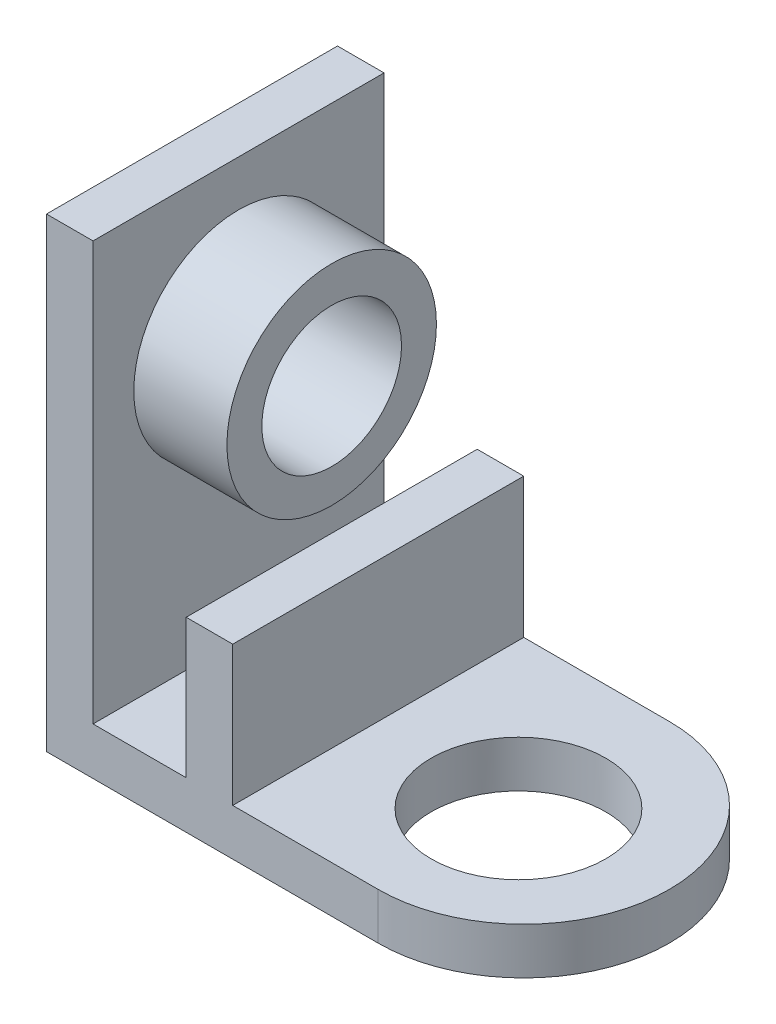
ISO-10303-21;
HEADER;
FILE_DESCRIPTION(('STEP AP214'),'2;1');
FILE_NAME('part.step','',(''),(''),'','','');
FILE_SCHEMA(('AUTOMOTIVE_DESIGN { 1 0 10303 214 1 1 1 1 }'));
ENDSEC;
DATA;
#1=APPLICATION_CONTEXT('core data for automotive mechanical design processes');
#2=APPLICATION_PROTOCOL_DEFINITION('international standard','automotive_design',2000,#1);
#3=PRODUCT_CONTEXT('',#1,'mechanical');
#4=PRODUCT('Part','Part','',(#3));
#5=PRODUCT_RELATED_PRODUCT_CATEGORY('part','',(#4));
#6=PRODUCT_DEFINITION_FORMATION('','',#4);
#7=PRODUCT_DEFINITION_CONTEXT('part definition',#1,'design');
#8=PRODUCT_DEFINITION('design','',#6,#7);
#9=PRODUCT_DEFINITION_SHAPE('','',#8);
#10=(LENGTH_UNIT() NAMED_UNIT(*) SI_UNIT(.MILLI.,.METRE.));
#11=(NAMED_UNIT(*) PLANE_ANGLE_UNIT() SI_UNIT($,.RADIAN.));
#12=(NAMED_UNIT(*) SI_UNIT($,.STERADIAN.) SOLID_ANGLE_UNIT());
#13=UNCERTAINTY_MEASURE_WITH_UNIT(LENGTH_MEASURE(1.E-05),#10,'distance_accuracy_value','');
#14=(GEOMETRIC_REPRESENTATION_CONTEXT(3) GLOBAL_UNCERTAINTY_ASSIGNED_CONTEXT((#13)) GLOBAL_UNIT_ASSIGNED_CONTEXT((#10,
#11,#12)) REPRESENTATION_CONTEXT('',''));
#15=CARTESIAN_POINT('',(0.,0.,0.));
#16=DIRECTION('',(0.,0.,1.));
#17=DIRECTION('',(1.,0.,0.));
#18=AXIS2_PLACEMENT_3D('',#15,#16,#17);
#19=CARTESIAN_POINT('',(203.2,2032.,1270.));
#20=DIRECTION('',(0.,-1.,0.));
#21=DIRECTION('',(0.,0.,-1.));
#22=AXIS2_PLACEMENT_3D('',#19,#20,#21);
#23=PLANE('',#22);
#24=DIRECTION('',(-1.,0.,0.));
#25=VECTOR('',#24,1.);
#26=CARTESIAN_POINT('',(203.2,2032.,0.));
#27=LINE('',#26,#25);
#28=CARTESIAN_POINT('',(203.2,2032.,0.));
#29=VERTEX_POINT('',#28);
#30=CARTESIAN_POINT('',(-2.22044604925031E-13,2032.,0.));
#31=VERTEX_POINT('',#30);
#32=EDGE_CURVE('E159',#29,#31,#27,.T.);
#33=ORIENTED_EDGE('',*,*,#32,.T.);
#34=DIRECTION('',(0.,0.,-1.));
#35=VECTOR('',#34,1.);
#36=CARTESIAN_POINT('',(-2.22044604925031E-13,2032.,1270.));
#37=LINE('',#36,#35);
#38=CARTESIAN_POINT('',(-2.22044604925031E-13,2032.,1270.));
#39=VERTEX_POINT('',#38);
#40=EDGE_CURVE('E55',#39,#31,#37,.T.);
#41=ORIENTED_EDGE('',*,*,#40,.F.);
#42=DIRECTION('',(-1.,0.,0.));
#43=VECTOR('',#42,1.);
#44=CARTESIAN_POINT('',(203.2,2032.,1270.));
#45=LINE('',#44,#43);
#46=CARTESIAN_POINT('',(203.2,2032.,1270.));
#47=VERTEX_POINT('',#46);
#48=EDGE_CURVE('E189',#47,#39,#45,.T.);
#49=ORIENTED_EDGE('',*,*,#48,.F.);
#50=DIRECTION('',(0.,0.,-1.));
#51=VECTOR('',#50,1.);
#52=CARTESIAN_POINT('',(203.2,2032.,1270.));
#53=LINE('',#52,#51);
#54=EDGE_CURVE('E155',#47,#29,#53,.T.);
#55=ORIENTED_EDGE('',*,*,#54,.T.);
#56=EDGE_LOOP('',(#33,#41,#49,#55));
#57=FACE_BOUND('',#56,.T.);
#58=ADVANCED_FACE('F45',(#57),#23,.F.);
#59=CARTESIAN_POINT('',(-2.22044604925031E-13,2032.,1270.));
#60=DIRECTION('',(1.,0.,0.));
#61=DIRECTION('',(0.,1.,0.));
#62=AXIS2_PLACEMENT_3D('',#59,#60,#61);
#63=PLANE('',#62);
#64=CARTESIAN_POINT('',(-2.22044604925031E-13,1369.5173700675,635.));
#65=DIRECTION('',(1.,0.,0.));
#66=DIRECTION('',(0.,0.,-1.));
#67=AXIS2_PLACEMENT_3D('',#64,#65,#66);
#68=CIRCLE('',#67,304.8);
#69=CARTESIAN_POINT('',(-2.22044603451988E-13,1369.5173700675,330.2));
#70=VERTEX_POINT('',#69);
#71=EDGE_CURVE('E386',#70,#70,#68,.T.);
#72=ORIENTED_EDGE('',*,*,#71,.T.);
#73=EDGE_LOOP('',(#72));
#74=FACE_BOUND('',#73,.T.);
#75=DIRECTION('',(0.,-1.,0.));
#76=VECTOR('',#75,1.);
#77=CARTESIAN_POINT('',(-2.22044604925031E-13,2032.,0.));
#78=LINE('',#77,#76);
#79=CARTESIAN_POINT('',(0.,0.,0.));
#80=VERTEX_POINT('',#79);
#81=EDGE_CURVE('E163',#31,#80,#78,.T.);
#82=ORIENTED_EDGE('',*,*,#81,.T.);
#83=DIRECTION('',(0.,0.,-1.));
#84=VECTOR('',#83,1.);
#85=CARTESIAN_POINT('',(0.,0.,1270.));
#86=LINE('',#85,#84);
#87=CARTESIAN_POINT('',(0.,0.,1270.));
#88=VERTEX_POINT('',#87);
#89=EDGE_CURVE('E204',#88,#80,#86,.T.);
#90=ORIENTED_EDGE('',*,*,#89,.F.);
#91=DIRECTION('',(0.,-1.,0.));
#92=VECTOR('',#91,1.);
#93=CARTESIAN_POINT('',(-2.22044604925031E-13,2032.,1270.));
#94=LINE('',#93,#92);
#95=EDGE_CURVE('E111',#39,#88,#94,.T.);
#96=ORIENTED_EDGE('',*,*,#95,.F.);
#97=ORIENTED_EDGE('',*,*,#40,.T.);
#98=EDGE_LOOP('',(#82,#90,#96,#97));
#99=FACE_BOUND('',#98,.T.);
#100=ADVANCED_FACE('F282',(#74,#99),#63,.F.);
#101=CARTESIAN_POINT('',(0.,0.,1270.));
#102=DIRECTION('',(0.,1.,0.));
#103=DIRECTION('',(0.,0.,1.));
#104=AXIS2_PLACEMENT_3D('',#101,#102,#103);
#105=PLANE('',#104);
#106=CARTESIAN_POINT('',(1447.8,0.,658.082587811802));
#107=DIRECTION('',(0.,1.,0.));
#108=DIRECTION('',(0.,0.,1.));
#109=AXIS2_PLACEMENT_3D('',#106,#107,#108);
#110=CIRCLE('',#109,381.);
#111=CARTESIAN_POINT('',(1447.8,0.,1039.0825878118));
#112=VERTEX_POINT('',#111);
#113=EDGE_CURVE('E214',#112,#112,#110,.T.);
#114=ORIENTED_EDGE('',*,*,#113,.T.);
#115=EDGE_LOOP('',(#114));
#116=FACE_BOUND('',#115,.T.);
#117=DIRECTION('',(1.,0.,0.));
#118=VECTOR('',#117,1.);
#119=CARTESIAN_POINT('',(0.,0.,0.));
#120=LINE('',#119,#118);
#121=CARTESIAN_POINT('',(1447.8,0.,0.));
#122=VERTEX_POINT('',#121);
#123=EDGE_CURVE('E167',#80,#122,#120,.T.);
#124=ORIENTED_EDGE('',*,*,#123,.T.);
#125=CARTESIAN_POINT('',(1447.8,0.,635.));
#126=DIRECTION('',(0.,1.,0.));
#127=DIRECTION('',(0.,0.,-1.));
#128=AXIS2_PLACEMENT_3D('',#125,#126,#127);
#129=CIRCLE('',#128,635.);
#130=CARTESIAN_POINT('',(1447.8,0.,1270.));
#131=VERTEX_POINT('',#130);
#132=EDGE_CURVE('E164',#131,#122,#129,.T.);
#133=ORIENTED_EDGE('',*,*,#132,.F.);
#134=DIRECTION('',(1.,0.,0.));
#135=VECTOR('',#134,1.);
#136=CARTESIAN_POINT('',(0.,0.,1270.));
#137=LINE('',#136,#135);
#138=EDGE_CURVE('E238',#88,#131,#137,.T.);
#139=ORIENTED_EDGE('',*,*,#138,.F.);
#140=ORIENTED_EDGE('',*,*,#89,.T.);
#141=EDGE_LOOP('',(#124,#133,#139,#140));
#142=FACE_BOUND('',#141,.T.);
#143=ADVANCED_FACE('F287',(#116,#142),#105,.F.);
#144=CARTESIAN_POINT('',(1447.8,203.2,1270.));
#145=DIRECTION('',(0.,-1.,0.));
#146=DIRECTION('',(0.,0.,-1.));
#147=AXIS2_PLACEMENT_3D('',#144,#145,#146);
#148=PLANE('',#147);
#149=CARTESIAN_POINT('',(1447.8,203.2,658.082587811802));
#150=DIRECTION('',(0.,-1.,0.));
#151=DIRECTION('',(0.,0.,-1.));
#152=AXIS2_PLACEMENT_3D('',#149,#150,#151);
#153=CIRCLE('',#152,381.);
#154=CARTESIAN_POINT('',(1447.8,203.2,277.082587811802));
#155=VERTEX_POINT('',#154);
#156=EDGE_CURVE('E210',#155,#155,#153,.T.);
#157=ORIENTED_EDGE('',*,*,#156,.T.);
#158=EDGE_LOOP('',(#157));
#159=FACE_BOUND('',#158,.T.);
#160=DIRECTION('',(-1.,0.,0.));
#161=VECTOR('',#160,1.);
#162=CARTESIAN_POINT('',(1447.8,203.2,0.));
#163=LINE('',#162,#161);
#164=CARTESIAN_POINT('',(1447.8,203.2,0.));
#165=VERTEX_POINT('',#164);
#166=CARTESIAN_POINT('',(812.8,203.2,0.));
#167=VERTEX_POINT('',#166);
#168=EDGE_CURVE('E174',#165,#167,#163,.T.);
#169=ORIENTED_EDGE('',*,*,#168,.T.);
#170=DIRECTION('',(0.,0.,-1.));
#171=VECTOR('',#170,1.);
#172=CARTESIAN_POINT('',(812.8,203.2,1270.));
#173=LINE('',#172,#171);
#174=CARTESIAN_POINT('',(812.8,203.2,1270.));
#175=VERTEX_POINT('',#174);
#176=EDGE_CURVE('E200',#175,#167,#173,.T.);
#177=ORIENTED_EDGE('',*,*,#176,.F.);
#178=DIRECTION('',(-1.,0.,0.));
#179=VECTOR('',#178,1.);
#180=CARTESIAN_POINT('',(1447.8,203.2,1270.));
#181=LINE('',#180,#179);
#182=CARTESIAN_POINT('',(1447.8,203.2,1270.));
#183=VERTEX_POINT('',#182);
#184=EDGE_CURVE('E244',#183,#175,#181,.T.);
#185=ORIENTED_EDGE('',*,*,#184,.F.);
#186=CARTESIAN_POINT('',(1447.8,203.2,635.));
#187=DIRECTION('',(0.,1.,0.));
#188=DIRECTION('',(0.,0.,-1.));
#189=AXIS2_PLACEMENT_3D('',#186,#187,#188);
#190=CIRCLE('',#189,635.);
#191=EDGE_CURVE('E213',#183,#165,#190,.T.);
#192=ORIENTED_EDGE('',*,*,#191,.T.);
#193=EDGE_LOOP('',(#169,#177,#185,#192));
#194=FACE_BOUND('',#193,.T.);
#195=ADVANCED_FACE('F293',(#159,#194),#148,.F.);
#196=CARTESIAN_POINT('',(812.8,203.2,1270.));
#197=DIRECTION('',(-1.,0.,0.));
#198=DIRECTION('',(0.,0.,1.));
#199=AXIS2_PLACEMENT_3D('',#196,#197,#198);
#200=PLANE('',#199);
#201=DIRECTION('',(0.,1.,0.));
#202=VECTOR('',#201,1.);
#203=CARTESIAN_POINT('',(812.8,203.2,0.));
#204=LINE('',#203,#202);
#205=CARTESIAN_POINT('',(812.8,812.8,0.));
#206=VERTEX_POINT('',#205);
#207=EDGE_CURVE('E177',#167,#206,#204,.T.);
#208=ORIENTED_EDGE('',*,*,#207,.T.);
#209=DIRECTION('',(0.,0.,-1.));
#210=VECTOR('',#209,1.);
#211=CARTESIAN_POINT('',(812.8,812.8,1270.));
#212=LINE('',#211,#210);
#213=CARTESIAN_POINT('',(812.8,812.8,1270.));
#214=VERTEX_POINT('',#213);
#215=EDGE_CURVE('E196',#214,#206,#212,.T.);
#216=ORIENTED_EDGE('',*,*,#215,.F.);
#217=DIRECTION('',(0.,1.,0.));
#218=VECTOR('',#217,1.);
#219=CARTESIAN_POINT('',(812.8,203.2,1270.));
#220=LINE('',#219,#218);
#221=EDGE_CURVE('E247',#175,#214,#220,.T.);
#222=ORIENTED_EDGE('',*,*,#221,.F.);
#223=ORIENTED_EDGE('',*,*,#176,.T.);
#224=EDGE_LOOP('',(#208,#216,#222,#223));
#225=FACE_BOUND('',#224,.T.);
#226=ADVANCED_FACE('F255',(#225),#200,.F.);
#227=CARTESIAN_POINT('',(812.8,812.8,1270.));
#228=DIRECTION('',(0.,-1.,0.));
#229=DIRECTION('',(0.,0.,-1.));
#230=AXIS2_PLACEMENT_3D('',#227,#228,#229);
#231=PLANE('',#230);
#232=DIRECTION('',(-1.,0.,0.));
#233=VECTOR('',#232,1.);
#234=CARTESIAN_POINT('',(812.8,812.8,0.));
#235=LINE('',#234,#233);
#236=CARTESIAN_POINT('',(609.6,812.8,0.));
#237=VERTEX_POINT('',#236);
#238=EDGE_CURVE('E180',#206,#237,#235,.T.);
#239=ORIENTED_EDGE('',*,*,#238,.T.);
#240=DIRECTION('',(0.,0.,-1.));
#241=VECTOR('',#240,1.);
#242=CARTESIAN_POINT('',(609.6,812.8,1270.));
#243=LINE('',#242,#241);
#244=CARTESIAN_POINT('',(609.6,812.8,1270.));
#245=VERTEX_POINT('',#244);
#246=EDGE_CURVE('E148',#245,#237,#243,.T.);
#247=ORIENTED_EDGE('',*,*,#246,.F.);
#248=DIRECTION('',(-1.,0.,0.));
#249=VECTOR('',#248,1.);
#250=CARTESIAN_POINT('',(812.8,812.8,1270.));
#251=LINE('',#250,#249);
#252=EDGE_CURVE('E137',#214,#245,#251,.T.);
#253=ORIENTED_EDGE('',*,*,#252,.F.);
#254=ORIENTED_EDGE('',*,*,#215,.T.);
#255=EDGE_LOOP('',(#239,#247,#253,#254));
#256=FACE_BOUND('',#255,.T.);
#257=ADVANCED_FACE('F259',(#256),#231,.F.);
#258=CARTESIAN_POINT('',(609.6,812.8,1270.));
#259=DIRECTION('',(1.,0.,0.));
#260=DIRECTION('',(0.,1.,0.));
#261=AXIS2_PLACEMENT_3D('',#258,#259,#260);
#262=PLANE('',#261);
#263=DIRECTION('',(0.,-1.,0.));
#264=VECTOR('',#263,1.);
#265=CARTESIAN_POINT('',(609.6,812.8,0.));
#266=LINE('',#265,#264);
#267=CARTESIAN_POINT('',(609.6,206.327883969465,0.));
#268=VERTEX_POINT('',#267);
#269=EDGE_CURVE('E146',#237,#268,#266,.T.);
#270=ORIENTED_EDGE('',*,*,#269,.T.);
#271=DIRECTION('',(0.,0.,-1.));
#272=VECTOR('',#271,1.);
#273=CARTESIAN_POINT('',(609.6,206.327883969465,1270.));
#274=LINE('',#273,#272);
#275=CARTESIAN_POINT('',(609.6,206.327883969465,1270.));
#276=VERTEX_POINT('',#275);
#277=EDGE_CURVE('E143',#276,#268,#274,.T.);
#278=ORIENTED_EDGE('',*,*,#277,.F.);
#279=DIRECTION('',(0.,-1.,0.));
#280=VECTOR('',#279,1.);
#281=CARTESIAN_POINT('',(609.6,812.8,1270.));
#282=LINE('',#281,#280);
#283=EDGE_CURVE('E131',#245,#276,#282,.T.);
#284=ORIENTED_EDGE('',*,*,#283,.F.);
#285=ORIENTED_EDGE('',*,*,#246,.T.);
#286=EDGE_LOOP('',(#270,#278,#284,#285));
#287=FACE_BOUND('',#286,.T.);
#288=ADVANCED_FACE('F144',(#287),#262,.F.);
#289=CARTESIAN_POINT('',(609.6,206.327883969465,1270.));
#290=DIRECTION('',(0.,-1.,0.));
#291=DIRECTION('',(0.,0.,-1.));
#292=AXIS2_PLACEMENT_3D('',#289,#290,#291);
#293=PLANE('',#292);
#294=DIRECTION('',(-1.,0.,0.));
#295=VECTOR('',#294,1.);
#296=CARTESIAN_POINT('',(609.6,206.327883969465,0.));
#297=LINE('',#296,#295);
#298=CARTESIAN_POINT('',(203.2,206.327883969465,0.));
#299=VERTEX_POINT('',#298);
#300=EDGE_CURVE('E96',#268,#299,#297,.T.);
#301=ORIENTED_EDGE('',*,*,#300,.T.);
#302=DIRECTION('',(0.,0.,-1.));
#303=VECTOR('',#302,1.);
#304=CARTESIAN_POINT('',(203.2,206.327883969465,1270.));
#305=LINE('',#304,#303);
#306=CARTESIAN_POINT('',(203.2,206.327883969465,1270.));
#307=VERTEX_POINT('',#306);
#308=EDGE_CURVE('E149',#307,#299,#305,.T.);
#309=ORIENTED_EDGE('',*,*,#308,.F.);
#310=DIRECTION('',(-1.,0.,0.));
#311=VECTOR('',#310,1.);
#312=CARTESIAN_POINT('',(609.6,206.327883969465,1270.));
#313=LINE('',#312,#311);
#314=EDGE_CURVE('E135',#276,#307,#313,.T.);
#315=ORIENTED_EDGE('',*,*,#314,.F.);
#316=ORIENTED_EDGE('',*,*,#277,.T.);
#317=EDGE_LOOP('',(#301,#309,#315,#316));
#318=FACE_BOUND('',#317,.T.);
#319=ADVANCED_FACE('F151',(#318),#293,.F.);
#320=CARTESIAN_POINT('',(203.2,206.327883969465,1270.));
#321=DIRECTION('',(-1.,0.,0.));
#322=DIRECTION('',(0.,0.,1.));
#323=AXIS2_PLACEMENT_3D('',#320,#321,#322);
#324=PLANE('',#323);
#325=CARTESIAN_POINT('',(203.2,1374.72788396946,635.));
#326=DIRECTION('',(-1.,0.,0.));
#327=DIRECTION('',(0.,0.,1.));
#328=AXIS2_PLACEMENT_3D('',#325,#326,#327);
#329=CIRCLE('',#328,457.2);
#330=CARTESIAN_POINT('',(203.2,1374.72788396946,1092.2));
#331=VERTEX_POINT('',#330);
#332=EDGE_CURVE('E11',#331,#331,#329,.F.);
#333=ORIENTED_EDGE('',*,*,#332,.F.);
#334=EDGE_LOOP('',(#333));
#335=FACE_BOUND('',#334,.T.);
#336=DIRECTION('',(0.,1.,0.));
#337=VECTOR('',#336,1.);
#338=CARTESIAN_POINT('',(203.2,206.327883969465,0.));
#339=LINE('',#338,#337);
#340=EDGE_CURVE('E102',#299,#29,#339,.T.);
#341=ORIENTED_EDGE('',*,*,#340,.T.);
#342=ORIENTED_EDGE('',*,*,#54,.F.);
#343=DIRECTION('',(0.,1.,0.));
#344=VECTOR('',#343,1.);
#345=CARTESIAN_POINT('',(203.2,206.327883969465,1270.));
#346=LINE('',#345,#344);
#347=EDGE_CURVE('E63',#307,#47,#346,.T.);
#348=ORIENTED_EDGE('',*,*,#347,.F.);
#349=ORIENTED_EDGE('',*,*,#308,.T.);
#350=EDGE_LOOP('',(#341,#342,#348,#349));
#351=FACE_BOUND('',#350,.T.);
#352=ADVANCED_FACE('F267',(#335,#351),#324,.F.);
#353=CARTESIAN_POINT('',(0.,0.,1270.));
#354=DIRECTION('',(0.,0.,1.));
#355=DIRECTION('',(1.,0.,0.));
#356=AXIS2_PLACEMENT_3D('',#353,#354,#355);
#357=PLANE('',#356);
#358=ORIENTED_EDGE('',*,*,#48,.T.);
#359=ORIENTED_EDGE('',*,*,#95,.T.);
#360=ORIENTED_EDGE('',*,*,#138,.T.);
#361=DIRECTION('',(0.,1.,0.));
#362=VECTOR('',#361,1.);
#363=CARTESIAN_POINT('',(1447.8,0.,1270.));
#364=LINE('',#363,#362);
#365=EDGE_CURVE('E241',#131,#183,#364,.T.);
#366=ORIENTED_EDGE('',*,*,#365,.T.);
#367=ORIENTED_EDGE('',*,*,#184,.T.);
#368=ORIENTED_EDGE('',*,*,#221,.T.);
#369=ORIENTED_EDGE('',*,*,#252,.T.);
#370=ORIENTED_EDGE('',*,*,#283,.T.);
#371=ORIENTED_EDGE('',*,*,#314,.T.);
#372=ORIENTED_EDGE('',*,*,#347,.T.);
#373=EDGE_LOOP('',(#358,#359,#360,#366,#367,#368,#369,#370,#371,#372));
#374=FACE_BOUND('',#373,.T.);
#375=ADVANCED_FACE('F133',(#374),#357,.T.);
#376=CARTESIAN_POINT('',(0.,0.,0.));
#377=DIRECTION('',(0.,0.,1.));
#378=DIRECTION('',(1.,0.,0.));
#379=AXIS2_PLACEMENT_3D('',#376,#377,#378);
#380=PLANE('',#379);
#381=ORIENTED_EDGE('',*,*,#32,.F.);
#382=ORIENTED_EDGE('',*,*,#340,.F.);
#383=ORIENTED_EDGE('',*,*,#300,.F.);
#384=ORIENTED_EDGE('',*,*,#269,.F.);
#385=ORIENTED_EDGE('',*,*,#238,.F.);
#386=ORIENTED_EDGE('',*,*,#207,.F.);
#387=ORIENTED_EDGE('',*,*,#168,.F.);
#388=DIRECTION('',(0.,1.,0.));
#389=VECTOR('',#388,1.);
#390=CARTESIAN_POINT('',(1447.8,0.,0.));
#391=LINE('',#390,#389);
#392=EDGE_CURVE('E170',#122,#165,#391,.T.);
#393=ORIENTED_EDGE('',*,*,#392,.F.);
#394=ORIENTED_EDGE('',*,*,#123,.F.);
#395=ORIENTED_EDGE('',*,*,#81,.F.);
#396=EDGE_LOOP('',(#381,#382,#383,#384,#385,#386,#387,#393,#394,#395));
#397=FACE_BOUND('',#396,.T.);
#398=ADVANCED_FACE('F262',(#397),#380,.F.);
#399=CARTESIAN_POINT('',(1447.8,0.,635.));
#400=DIRECTION('',(0.,1.,0.));
#401=DIRECTION('',(0.,0.,1.));
#402=AXIS2_PLACEMENT_3D('',#399,#400,#401);
#403=CYLINDRICAL_SURFACE('',#402,635.);
#404=ORIENTED_EDGE('',*,*,#191,.F.);
#405=ORIENTED_EDGE('',*,*,#365,.F.);
#406=ORIENTED_EDGE('',*,*,#132,.T.);
#407=ORIENTED_EDGE('',*,*,#392,.T.);
#408=EDGE_LOOP('',(#404,#405,#406,#407));
#409=FACE_BOUND('',#408,.T.);
#410=ADVANCED_FACE('F324',(#409),#403,.T.);
#411=CARTESIAN_POINT('',(1447.8,0.,658.082587811802));
#412=DIRECTION('',(0.,1.,0.));
#413=DIRECTION('',(0.,0.,1.));
#414=AXIS2_PLACEMENT_3D('',#411,#412,#413);
#415=CYLINDRICAL_SURFACE('',#414,381.);
#416=ORIENTED_EDGE('',*,*,#113,.F.);
#417=EDGE_LOOP('',(#416));
#418=FACE_BOUND('',#417,.T.);
#419=ORIENTED_EDGE('',*,*,#156,.F.);
#420=EDGE_LOOP('',(#419));
#421=FACE_BOUND('',#420,.T.);
#422=ADVANCED_FACE('F331',(#418,#421),#415,.F.);
#423=CARTESIAN_POINT('',(609.6,1374.72788396946,635.));
#424=DIRECTION('',(-1.,0.,0.));
#425=DIRECTION('',(0.,0.,1.));
#426=AXIS2_PLACEMENT_3D('',#423,#424,#425);
#427=CYLINDRICAL_SURFACE('',#426,457.2);
#428=CARTESIAN_POINT('',(609.6,1374.72788396946,635.));
#429=DIRECTION('',(1.,0.,0.));
#430=DIRECTION('',(0.,0.,-1.));
#431=AXIS2_PLACEMENT_3D('',#428,#429,#430);
#432=CIRCLE('',#431,457.2);
#433=CARTESIAN_POINT('',(609.6,1374.72788396946,177.8));
#434=VERTEX_POINT('',#433);
#435=EDGE_CURVE('E222',#434,#434,#432,.T.);
#436=ORIENTED_EDGE('',*,*,#435,.F.);
#437=EDGE_LOOP('',(#436));
#438=FACE_BOUND('',#437,.T.);
#439=ORIENTED_EDGE('',*,*,#332,.T.);
#440=EDGE_LOOP('',(#439));
#441=FACE_BOUND('',#440,.T.);
#442=ADVANCED_FACE('F348',(#438,#441),#427,.T.);
#443=CARTESIAN_POINT('',(609.6,1374.72788396946,635.));
#444=DIRECTION('',(1.,0.,0.));
#445=DIRECTION('',(0.,0.,-1.));
#446=AXIS2_PLACEMENT_3D('',#443,#444,#445);
#447=PLANE('',#446);
#448=CARTESIAN_POINT('',(609.6,1369.5173700675,635.));
#449=DIRECTION('',(1.,0.,0.));
#450=DIRECTION('',(0.,0.,-1.));
#451=AXIS2_PLACEMENT_3D('',#448,#449,#450);
#452=CIRCLE('',#451,304.8);
#453=CARTESIAN_POINT('',(609.6,1369.5173700675,330.2));
#454=VERTEX_POINT('',#453);
#455=EDGE_CURVE('E48',#454,#454,#452,.T.);
#456=ORIENTED_EDGE('',*,*,#455,.F.);
#457=EDGE_LOOP('',(#456));
#458=FACE_BOUND('',#457,.T.);
#459=ORIENTED_EDGE('',*,*,#435,.T.);
#460=EDGE_LOOP('',(#459));
#461=FACE_BOUND('',#460,.T.);
#462=ADVANCED_FACE('F360',(#458,#461),#447,.T.);
#463=CARTESIAN_POINT('',(-2.22044604925031E-13,1369.5173700675,635.));
#464=DIRECTION('',(1.,0.,0.));
#465=DIRECTION('',(0.,0.,-1.));
#466=AXIS2_PLACEMENT_3D('',#463,#464,#465);
#467=CYLINDRICAL_SURFACE('',#466,304.8);
#468=CARTESIAN_POINT('',(609.6,1369.5173700675,330.2));
#469=CARTESIAN_POINT('',(603.25,1369.5173700675,330.2));
#470=CARTESIAN_POINT('',(596.9,1369.5173700675,330.2));
#471=CARTESIAN_POINT('',(584.2,1369.5173700675,330.2));
#472=CARTESIAN_POINT('',(577.85,1369.5173700675,330.2));
#473=CARTESIAN_POINT('',(565.15,1369.5173700675,330.2));
#474=CARTESIAN_POINT('',(558.8,1369.5173700675,330.2));
#475=CARTESIAN_POINT('',(546.1,1369.5173700675,330.2));
#476=CARTESIAN_POINT('',(539.75,1369.5173700675,330.2));
#477=CARTESIAN_POINT('',(527.05,1369.5173700675,330.2));
#478=CARTESIAN_POINT('',(520.7,1369.5173700675,330.2));
#479=CARTESIAN_POINT('',(508.,1369.5173700675,330.2));
#480=CARTESIAN_POINT('',(501.65,1369.5173700675,330.2));
#481=CARTESIAN_POINT('',(488.95,1369.5173700675,330.2));
#482=CARTESIAN_POINT('',(482.6,1369.5173700675,330.2));
#483=CARTESIAN_POINT('',(469.9,1369.5173700675,330.2));
#484=CARTESIAN_POINT('',(463.55,1369.5173700675,330.2));
#485=CARTESIAN_POINT('',(450.85,1369.5173700675,330.2));
#486=CARTESIAN_POINT('',(444.5,1369.5173700675,330.2));
#487=CARTESIAN_POINT('',(431.8,1369.5173700675,330.2));
#488=CARTESIAN_POINT('',(425.45,1369.5173700675,330.2));
#489=CARTESIAN_POINT('',(412.75,1369.5173700675,330.2));
#490=CARTESIAN_POINT('',(406.4,1369.5173700675,330.2));
#491=CARTESIAN_POINT('',(393.7,1369.5173700675,330.2));
#492=CARTESIAN_POINT('',(387.35,1369.5173700675,330.2));
#493=CARTESIAN_POINT('',(374.65,1369.5173700675,330.2));
#494=CARTESIAN_POINT('',(368.3,1369.5173700675,330.2));
#495=CARTESIAN_POINT('',(355.6,1369.5173700675,330.2));
#496=CARTESIAN_POINT('',(349.25,1369.5173700675,330.2));
#497=CARTESIAN_POINT('',(336.55,1369.5173700675,330.2));
#498=CARTESIAN_POINT('',(330.2,1369.5173700675,330.2));
#499=CARTESIAN_POINT('',(317.5,1369.5173700675,330.2));
#500=CARTESIAN_POINT('',(311.15,1369.5173700675,330.2));
#501=CARTESIAN_POINT('',(298.45,1369.5173700675,330.2));
#502=CARTESIAN_POINT('',(292.1,1369.5173700675,330.2));
#503=CARTESIAN_POINT('',(279.4,1369.5173700675,330.2));
#504=CARTESIAN_POINT('',(273.05,1369.5173700675,330.2));
#505=CARTESIAN_POINT('',(260.35,1369.5173700675,330.2));
#506=CARTESIAN_POINT('',(254.,1369.5173700675,330.2));
#507=CARTESIAN_POINT('',(241.3,1369.5173700675,330.2));
#508=CARTESIAN_POINT('',(234.95,1369.5173700675,330.2));
#509=CARTESIAN_POINT('',(222.25,1369.5173700675,330.2));
#510=CARTESIAN_POINT('',(215.9,1369.5173700675,330.2));
#511=CARTESIAN_POINT('',(203.2,1369.5173700675,330.2));
#512=CARTESIAN_POINT('',(196.85,1369.5173700675,330.2));
#513=CARTESIAN_POINT('',(184.15,1369.5173700675,330.2));
#514=CARTESIAN_POINT('',(177.8,1369.5173700675,330.2));
#515=CARTESIAN_POINT('',(165.1,1369.5173700675,330.2));
#516=CARTESIAN_POINT('',(158.75,1369.5173700675,330.2));
#517=CARTESIAN_POINT('',(146.05,1369.5173700675,330.2));
#518=CARTESIAN_POINT('',(139.7,1369.5173700675,330.2));
#519=CARTESIAN_POINT('',(127.,1369.5173700675,330.2));
#520=CARTESIAN_POINT('',(120.65,1369.5173700675,330.2));
#521=CARTESIAN_POINT('',(107.95,1369.5173700675,330.2));
#522=CARTESIAN_POINT('',(101.6,1369.5173700675,330.2));
#523=CARTESIAN_POINT('',(88.8999999999998,1369.5173700675,330.2));
#524=CARTESIAN_POINT('',(82.5499999999998,1369.5173700675,330.2));
#525=CARTESIAN_POINT('',(69.8499999999998,1369.5173700675,330.2));
#526=CARTESIAN_POINT('',(63.4999999999998,1369.5173700675,330.2));
#527=CARTESIAN_POINT('',(50.7999999999998,1369.5173700675,330.2));
#528=CARTESIAN_POINT('',(44.4499999999998,1369.5173700675,330.2));
#529=CARTESIAN_POINT('',(31.7499999999998,1369.5173700675,330.2));
#530=CARTESIAN_POINT('',(25.3999999999998,1369.5173700675,330.2));
#531=CARTESIAN_POINT('',(12.6999999999998,1369.5173700675,330.2));
#532=CARTESIAN_POINT('',(6.34999999999979,1369.5173700675,330.2));
#533=CARTESIAN_POINT('',(-2.22044604925031E-13,1369.5173700675,330.2));
#534=B_SPLINE_CURVE_WITH_KNOTS('',3,(#468,#469,#470,#471,#472,#473,#474,#475,#476,#477,#478,
#479,#480,#481,#482,#483,#484,#485,#486,#487,#488,#489,#490,#491,#492,#493,#494,#495,#496,#497,
#498,#499,#500,#501,#502,#503,#504,#505,#506,#507,#508,#509,#510,#511,#512,#513,#514,#515,#516,
#517,#518,#519,#520,#521,#522,#523,#524,#525,#526,#527,#528,#529,#530,#531,#532,#533),
.UNSPECIFIED.,.F.,.F.,(4,2,2,2,2,2,2,2,2,2,2,2,2,2,2,2,2,2,2,2,2,2,2,2,2,2,2,2,2,2,2,2,4),(0.,
19.05,38.1,57.15,76.2,95.2500000000001,114.3,133.35,152.4,171.45,190.5,209.55,228.6,247.65,
266.7,285.75,304.8,323.85,342.9,361.95,381.,400.05,419.1,438.15,457.2,476.25,495.3,514.35,533.4,
552.45,571.5,590.55,609.6),.UNSPECIFIED.);
#535=EDGE_CURVE('BSEAM369',#454,#70,#534,.T.);
#536=ORIENTED_EDGE('',*,*,#455,.T.);
#537=ORIENTED_EDGE('',*,*,#71,.F.);
#538=ORIENTED_EDGE('',*,*,#535,.T.);
#539=ORIENTED_EDGE('',*,*,#535,.F.);
#540=EDGE_LOOP('',(#536,#538,#537,#539));
#541=FACE_BOUND('',#540,.T.);
#542=ADVANCED_FACE('F369',(#541),#467,.F.);
#543=CLOSED_SHELL('',(#58,#100,#143,#195,#226,#257,#288,#319,#352,#375,#398,#410,#422,#442,#462,#542));
#544=MANIFOLD_SOLID_BREP('B2',#543);
#545=ADVANCED_BREP_SHAPE_REPRESENTATION('',(#18,#544),#14);
#546=SHAPE_DEFINITION_REPRESENTATION(#9,#545);
ENDSEC;
END-ISO-10303-21;
